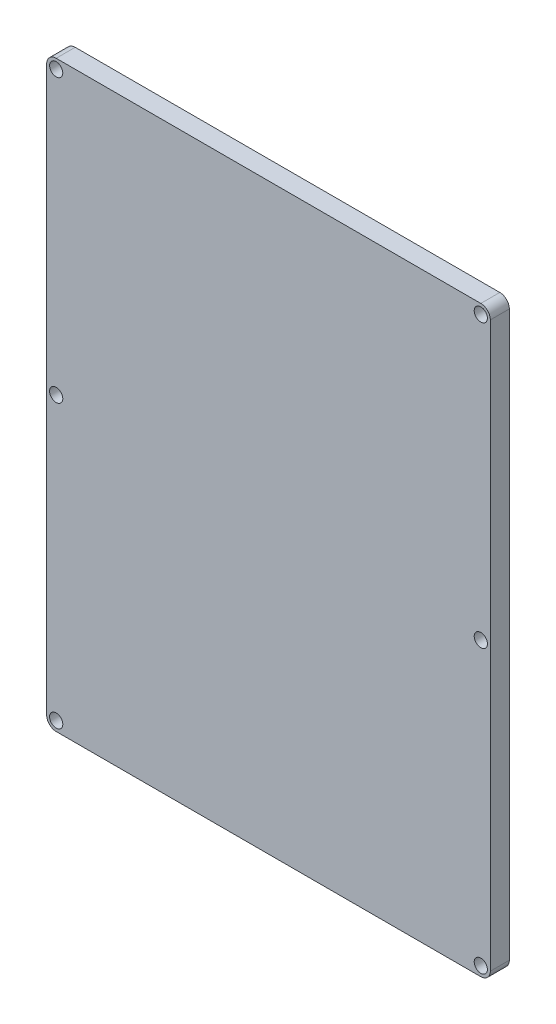
ISO-10303-21;
HEADER;
FILE_DESCRIPTION(('STEP AP214'),'2;1');
FILE_NAME('part.step','',(''),(''),'','','');
FILE_SCHEMA(('AUTOMOTIVE_DESIGN { 1 0 10303 214 1 1 1 1 }'));
ENDSEC;
DATA;
#1=APPLICATION_CONTEXT('core data for automotive mechanical design processes');
#2=APPLICATION_PROTOCOL_DEFINITION('international standard','automotive_design',2000,#1);
#3=PRODUCT_CONTEXT('',#1,'mechanical');
#4=PRODUCT('Part','Part','',(#3));
#5=PRODUCT_RELATED_PRODUCT_CATEGORY('part','',(#4));
#6=PRODUCT_DEFINITION_FORMATION('','',#4);
#7=PRODUCT_DEFINITION_CONTEXT('part definition',#1,'design');
#8=PRODUCT_DEFINITION('design','',#6,#7);
#9=PRODUCT_DEFINITION_SHAPE('','',#8);
#10=(LENGTH_UNIT() NAMED_UNIT(*) SI_UNIT(.MILLI.,.METRE.));
#11=(NAMED_UNIT(*) PLANE_ANGLE_UNIT() SI_UNIT($,.RADIAN.));
#12=(NAMED_UNIT(*) SI_UNIT($,.STERADIAN.) SOLID_ANGLE_UNIT());
#13=UNCERTAINTY_MEASURE_WITH_UNIT(LENGTH_MEASURE(1.E-05),#10,'distance_accuracy_value','');
#14=(GEOMETRIC_REPRESENTATION_CONTEXT(3) GLOBAL_UNCERTAINTY_ASSIGNED_CONTEXT((#13)) GLOBAL_UNIT_ASSIGNED_CONTEXT((#10,
#11,#12)) REPRESENTATION_CONTEXT('',''));
#15=CARTESIAN_POINT('',(0.,0.,0.));
#16=DIRECTION('',(0.,0.,1.));
#17=DIRECTION('',(1.,0.,0.));
#18=AXIS2_PLACEMENT_3D('',#15,#16,#17);
#19=CARTESIAN_POINT('',(-33.5,-46.,3.));
#20=DIRECTION('',(0.,1.,0.));
#21=DIRECTION('',(0.,0.,1.));
#22=AXIS2_PLACEMENT_3D('',#19,#20,#21);
#23=PLANE('',#22);
#24=DIRECTION('',(0.,0.,-1.));
#25=VECTOR('',#24,1.);
#26=CARTESIAN_POINT('',(-26.,-46.,0.1));
#27=LINE('',#26,#25);
#28=CARTESIAN_POINT('',(-26.,-46.,0.1));
#29=VERTEX_POINT('',#28);
#30=CARTESIAN_POINT('',(-26.,-46.,0.));
#31=VERTEX_POINT('',#30);
#32=EDGE_CURVE('E230',#29,#31,#27,.T.);
#33=ORIENTED_EDGE('',*,*,#32,.F.);
#34=DIRECTION('',(-1.,0.,0.));
#35=VECTOR('',#34,1.);
#36=CARTESIAN_POINT('',(-26.,-46.,0.1));
#37=LINE('',#36,#35);
#38=CARTESIAN_POINT('',(28.,-46.,0.1));
#39=VERTEX_POINT('',#38);
#40=EDGE_CURVE('E234',#39,#29,#37,.T.);
#41=ORIENTED_EDGE('',*,*,#40,.F.);
#42=DIRECTION('',(0.,0.,-1.));
#43=VECTOR('',#42,1.);
#44=CARTESIAN_POINT('',(28.,-46.,0.1));
#45=LINE('',#44,#43);
#46=CARTESIAN_POINT('',(28.,-46.,0.));
#47=VERTEX_POINT('',#46);
#48=EDGE_CURVE('E249',#39,#47,#45,.T.);
#49=ORIENTED_EDGE('',*,*,#48,.T.);
#50=DIRECTION('',(1.,0.,0.));
#51=VECTOR('',#50,1.);
#52=CARTESIAN_POINT('',(-33.5,-46.,0.));
#53=LINE('',#52,#51);
#54=CARTESIAN_POINT('',(33.5,-46.,0.));
#55=VERTEX_POINT('',#54);
#56=EDGE_CURVE('E130',#47,#55,#53,.T.);
#57=ORIENTED_EDGE('',*,*,#56,.T.);
#58=DIRECTION('',(0.,0.,-1.));
#59=VECTOR('',#58,1.);
#60=CARTESIAN_POINT('',(33.5,-46.,3.));
#61=LINE('',#60,#59);
#62=CARTESIAN_POINT('',(33.5,-46.,3.));
#63=VERTEX_POINT('',#62);
#64=EDGE_CURVE('E126',#63,#55,#61,.T.);
#65=ORIENTED_EDGE('',*,*,#64,.F.);
#66=DIRECTION('',(1.,0.,0.));
#67=VECTOR('',#66,1.);
#68=CARTESIAN_POINT('',(-33.5,-46.,3.));
#69=LINE('',#68,#67);
#70=CARTESIAN_POINT('',(-33.5,-46.,3.));
#71=VERTEX_POINT('',#70);
#72=EDGE_CURVE('E113',#71,#63,#69,.T.);
#73=ORIENTED_EDGE('',*,*,#72,.F.);
#74=DIRECTION('',(0.,0.,-1.));
#75=VECTOR('',#74,1.);
#76=CARTESIAN_POINT('',(-33.5,-46.,3.));
#77=LINE('',#76,#75);
#78=CARTESIAN_POINT('',(-33.5,-46.,0.));
#79=VERTEX_POINT('',#78);
#80=EDGE_CURVE('E133',#71,#79,#77,.T.);
#81=ORIENTED_EDGE('',*,*,#80,.T.);
#82=EDGE_CURVE('E154',#79,#31,#53,.T.);
#83=ORIENTED_EDGE('',*,*,#82,.T.);
#84=EDGE_LOOP('',(#33,#41,#49,#57,#65,#73,#81,#83));
#85=FACE_BOUND('',#84,.T.);
#86=ADVANCED_FACE('F32',(#85),#23,.F.);
#87=CARTESIAN_POINT('',(33.5,44.5,3.));
#88=DIRECTION('',(0.,0.,-1.));
#89=DIRECTION('',(-1.,0.,0.));
#90=AXIS2_PLACEMENT_3D('',#87,#88,#89);
#91=CYLINDRICAL_SURFACE('',#90,1.5);
#92=CARTESIAN_POINT('',(33.5,44.5,0.));
#93=DIRECTION('',(0.,0.,1.));
#94=DIRECTION('',(-1.,0.,0.));
#95=AXIS2_PLACEMENT_3D('',#92,#93,#94);
#96=CIRCLE('',#95,1.5);
#97=CARTESIAN_POINT('',(35.,44.5,0.));
#98=VERTEX_POINT('',#97);
#99=CARTESIAN_POINT('',(33.5,46.,0.));
#100=VERTEX_POINT('',#99);
#101=EDGE_CURVE('E142',#98,#100,#96,.T.);
#102=ORIENTED_EDGE('',*,*,#101,.T.);
#103=DIRECTION('',(0.,0.,-1.));
#104=VECTOR('',#103,1.);
#105=CARTESIAN_POINT('',(33.5,46.,3.));
#106=LINE('',#105,#104);
#107=CARTESIAN_POINT('',(33.5,46.,3.));
#108=VERTEX_POINT('',#107);
#109=EDGE_CURVE('E11',#108,#100,#106,.T.);
#110=ORIENTED_EDGE('',*,*,#109,.F.);
#111=CARTESIAN_POINT('',(33.5,44.5,3.));
#112=DIRECTION('',(0.,0.,1.));
#113=DIRECTION('',(-1.,0.,0.));
#114=AXIS2_PLACEMENT_3D('',#111,#112,#113);
#115=CIRCLE('',#114,1.5);
#116=CARTESIAN_POINT('',(35.,44.5,3.));
#117=VERTEX_POINT('',#116);
#118=EDGE_CURVE('E160',#117,#108,#115,.T.);
#119=ORIENTED_EDGE('',*,*,#118,.F.);
#120=DIRECTION('',(0.,0.,-1.));
#121=VECTOR('',#120,1.);
#122=CARTESIAN_POINT('',(35.,44.5,3.));
#123=LINE('',#122,#121);
#124=EDGE_CURVE('E138',#117,#98,#123,.T.);
#125=ORIENTED_EDGE('',*,*,#124,.T.);
#126=EDGE_LOOP('',(#102,#110,#119,#125));
#127=FACE_BOUND('',#126,.T.);
#128=ADVANCED_FACE('F34',(#127),#91,.T.);
#129=CARTESIAN_POINT('',(-33.5,46.,3.));
#130=DIRECTION('',(0.,-1.,0.));
#131=DIRECTION('',(0.,0.,-1.));
#132=AXIS2_PLACEMENT_3D('',#129,#130,#131);
#133=PLANE('',#132);
#134=DIRECTION('',(-1.,0.,0.));
#135=VECTOR('',#134,1.);
#136=CARTESIAN_POINT('',(-33.5,46.,0.));
#137=LINE('',#136,#135);
#138=CARTESIAN_POINT('',(-33.5,46.,0.));
#139=VERTEX_POINT('',#138);
#140=EDGE_CURVE('E145',#100,#139,#137,.T.);
#141=ORIENTED_EDGE('',*,*,#140,.T.);
#142=DIRECTION('',(0.,0.,-1.));
#143=VECTOR('',#142,1.);
#144=CARTESIAN_POINT('',(-33.5,46.,3.));
#145=LINE('',#144,#143);
#146=CARTESIAN_POINT('',(-33.5,46.,3.));
#147=VERTEX_POINT('',#146);
#148=EDGE_CURVE('E40',#147,#139,#145,.T.);
#149=ORIENTED_EDGE('',*,*,#148,.F.);
#150=DIRECTION('',(-1.,0.,0.));
#151=VECTOR('',#150,1.);
#152=CARTESIAN_POINT('',(-33.5,46.,3.));
#153=LINE('',#152,#151);
#154=EDGE_CURVE('E97',#108,#147,#153,.T.);
#155=ORIENTED_EDGE('',*,*,#154,.F.);
#156=ORIENTED_EDGE('',*,*,#109,.T.);
#157=EDGE_LOOP('',(#141,#149,#155,#156));
#158=FACE_BOUND('',#157,.T.);
#159=ADVANCED_FACE('F329',(#158),#133,.F.);
#160=CARTESIAN_POINT('',(-33.5,44.5,3.));
#161=DIRECTION('',(0.,0.,-1.));
#162=DIRECTION('',(-1.,0.,0.));
#163=AXIS2_PLACEMENT_3D('',#160,#161,#162);
#164=CYLINDRICAL_SURFACE('',#163,1.5);
#165=CARTESIAN_POINT('',(-33.5,44.5,0.));
#166=DIRECTION('',(0.,0.,1.));
#167=DIRECTION('',(-1.,0.,0.));
#168=AXIS2_PLACEMENT_3D('',#165,#166,#167);
#169=CIRCLE('',#168,1.5);
#170=CARTESIAN_POINT('',(-35.,44.5,0.));
#171=VERTEX_POINT('',#170);
#172=EDGE_CURVE('E148',#139,#171,#169,.T.);
#173=ORIENTED_EDGE('',*,*,#172,.T.);
#174=DIRECTION('',(0.,0.,-1.));
#175=VECTOR('',#174,1.);
#176=CARTESIAN_POINT('',(-35.,44.5,3.));
#177=LINE('',#176,#175);
#178=CARTESIAN_POINT('',(-35.,44.5,3.));
#179=VERTEX_POINT('',#178);
#180=EDGE_CURVE('E167',#179,#171,#177,.T.);
#181=ORIENTED_EDGE('',*,*,#180,.F.);
#182=CARTESIAN_POINT('',(-33.5,44.5,3.));
#183=DIRECTION('',(0.,0.,1.));
#184=DIRECTION('',(-1.,0.,0.));
#185=AXIS2_PLACEMENT_3D('',#182,#183,#184);
#186=CIRCLE('',#185,1.5);
#187=EDGE_CURVE('E175',#147,#179,#186,.T.);
#188=ORIENTED_EDGE('',*,*,#187,.F.);
#189=ORIENTED_EDGE('',*,*,#148,.T.);
#190=EDGE_LOOP('',(#173,#181,#188,#189));
#191=FACE_BOUND('',#190,.T.);
#192=ADVANCED_FACE('F173',(#191),#164,.T.);
#193=CARTESIAN_POINT('',(-35.,44.5,3.));
#194=DIRECTION('',(1.,0.,0.));
#195=DIRECTION('',(0.,1.,0.));
#196=AXIS2_PLACEMENT_3D('',#193,#194,#195);
#197=PLANE('',#196);
#198=DIRECTION('',(0.,-1.,0.));
#199=VECTOR('',#198,1.);
#200=CARTESIAN_POINT('',(-35.,44.5,0.));
#201=LINE('',#200,#199);
#202=CARTESIAN_POINT('',(-35.,-44.5,0.));
#203=VERTEX_POINT('',#202);
#204=EDGE_CURVE('E150',#171,#203,#201,.T.);
#205=ORIENTED_EDGE('',*,*,#204,.T.);
#206=DIRECTION('',(0.,0.,-1.));
#207=VECTOR('',#206,1.);
#208=CARTESIAN_POINT('',(-35.,-44.5,3.));
#209=LINE('',#208,#207);
#210=CARTESIAN_POINT('',(-35.,-44.5,3.));
#211=VERTEX_POINT('',#210);
#212=EDGE_CURVE('E164',#211,#203,#209,.T.);
#213=ORIENTED_EDGE('',*,*,#212,.F.);
#214=DIRECTION('',(0.,-1.,0.));
#215=VECTOR('',#214,1.);
#216=CARTESIAN_POINT('',(-35.,44.5,3.));
#217=LINE('',#216,#215);
#218=EDGE_CURVE('E189',#179,#211,#217,.T.);
#219=ORIENTED_EDGE('',*,*,#218,.F.);
#220=ORIENTED_EDGE('',*,*,#180,.T.);
#221=EDGE_LOOP('',(#205,#213,#219,#220));
#222=FACE_BOUND('',#221,.T.);
#223=ADVANCED_FACE('F185',(#222),#197,.F.);
#224=CARTESIAN_POINT('',(-33.5,-44.5,3.));
#225=DIRECTION('',(0.,0.,-1.));
#226=DIRECTION('',(-1.,0.,0.));
#227=AXIS2_PLACEMENT_3D('',#224,#225,#226);
#228=CYLINDRICAL_SURFACE('',#227,1.5);
#229=CARTESIAN_POINT('',(-33.5,-44.5,0.));
#230=DIRECTION('',(0.,0.,1.));
#231=DIRECTION('',(-1.,0.,0.));
#232=AXIS2_PLACEMENT_3D('',#229,#230,#231);
#233=CIRCLE('',#232,1.5);
#234=EDGE_CURVE('E152',#203,#79,#233,.T.);
#235=ORIENTED_EDGE('',*,*,#234,.T.);
#236=ORIENTED_EDGE('',*,*,#80,.F.);
#237=CARTESIAN_POINT('',(-33.5,-44.5,3.));
#238=DIRECTION('',(0.,0.,1.));
#239=DIRECTION('',(-1.,0.,0.));
#240=AXIS2_PLACEMENT_3D('',#237,#238,#239);
#241=CIRCLE('',#240,1.5);
#242=EDGE_CURVE('E120',#211,#71,#241,.T.);
#243=ORIENTED_EDGE('',*,*,#242,.F.);
#244=ORIENTED_EDGE('',*,*,#212,.T.);
#245=EDGE_LOOP('',(#235,#236,#243,#244));
#246=FACE_BOUND('',#245,.T.);
#247=ADVANCED_FACE('F188',(#246),#228,.T.);
#248=CARTESIAN_POINT('',(33.5,-44.5,3.));
#249=DIRECTION('',(0.,0.,-1.));
#250=DIRECTION('',(-1.,0.,0.));
#251=AXIS2_PLACEMENT_3D('',#248,#249,#250);
#252=CYLINDRICAL_SURFACE('',#251,1.5);
#253=CARTESIAN_POINT('',(33.5,-44.5,0.));
#254=DIRECTION('',(0.,0.,1.));
#255=DIRECTION('',(-1.,0.,0.));
#256=AXIS2_PLACEMENT_3D('',#253,#254,#255);
#257=CIRCLE('',#256,1.5);
#258=CARTESIAN_POINT('',(35.,-44.5,0.));
#259=VERTEX_POINT('',#258);
#260=EDGE_CURVE('E157',#55,#259,#257,.T.);
#261=ORIENTED_EDGE('',*,*,#260,.T.);
#262=DIRECTION('',(0.,0.,-1.));
#263=VECTOR('',#262,1.);
#264=CARTESIAN_POINT('',(35.,-44.5,3.));
#265=LINE('',#264,#263);
#266=CARTESIAN_POINT('',(35.,-44.5,3.));
#267=VERTEX_POINT('',#266);
#268=EDGE_CURVE('E134',#267,#259,#265,.T.);
#269=ORIENTED_EDGE('',*,*,#268,.F.);
#270=CARTESIAN_POINT('',(33.5,-44.5,3.));
#271=DIRECTION('',(0.,0.,1.));
#272=DIRECTION('',(-1.,0.,0.));
#273=AXIS2_PLACEMENT_3D('',#270,#271,#272);
#274=CIRCLE('',#273,1.5);
#275=EDGE_CURVE('E117',#63,#267,#274,.T.);
#276=ORIENTED_EDGE('',*,*,#275,.F.);
#277=ORIENTED_EDGE('',*,*,#64,.T.);
#278=EDGE_LOOP('',(#261,#269,#276,#277));
#279=FACE_BOUND('',#278,.T.);
#280=ADVANCED_FACE('F136',(#279),#252,.T.);
#281=CARTESIAN_POINT('',(35.,44.5,3.));
#282=DIRECTION('',(-1.,0.,0.));
#283=DIRECTION('',(0.,-1.,0.));
#284=AXIS2_PLACEMENT_3D('',#281,#282,#283);
#285=PLANE('',#284);
#286=DIRECTION('',(0.,1.,0.));
#287=VECTOR('',#286,1.);
#288=CARTESIAN_POINT('',(35.,44.5,0.));
#289=LINE('',#288,#287);
#290=EDGE_CURVE('E89',#259,#98,#289,.T.);
#291=ORIENTED_EDGE('',*,*,#290,.T.);
#292=ORIENTED_EDGE('',*,*,#124,.F.);
#293=DIRECTION('',(0.,1.,0.));
#294=VECTOR('',#293,1.);
#295=CARTESIAN_POINT('',(35.,44.5,3.));
#296=LINE('',#295,#294);
#297=EDGE_CURVE('E56',#267,#117,#296,.T.);
#298=ORIENTED_EDGE('',*,*,#297,.F.);
#299=ORIENTED_EDGE('',*,*,#268,.T.);
#300=EDGE_LOOP('',(#291,#292,#298,#299));
#301=FACE_BOUND('',#300,.T.);
#302=ADVANCED_FACE('F325',(#301),#285,.F.);
#303=CARTESIAN_POINT('',(33.5,44.5,3.));
#304=DIRECTION('',(0.,0.,-1.));
#305=DIRECTION('',(-1.,0.,0.));
#306=AXIS2_PLACEMENT_3D('',#303,#304,#305);
#307=PLANE('',#306);
#308=CARTESIAN_POINT('',(33.5,44.5,3.));
#309=DIRECTION('',(0.,0.,-1.));
#310=DIRECTION('',(-1.,0.,0.));
#311=AXIS2_PLACEMENT_3D('',#308,#309,#310);
#312=CIRCLE('',#311,1.0414);
#313=CARTESIAN_POINT('',(32.4586,44.5,3.));
#314=VERTEX_POINT('',#313);
#315=EDGE_CURVE('E224',#314,#314,#312,.T.);
#316=ORIENTED_EDGE('',*,*,#315,.T.);
#317=EDGE_LOOP('',(#316));
#318=FACE_BOUND('',#317,.T.);
#319=CARTESIAN_POINT('',(-33.5,-44.5,3.));
#320=DIRECTION('',(0.,0.,-1.));
#321=DIRECTION('',(-1.,0.,0.));
#322=AXIS2_PLACEMENT_3D('',#319,#320,#321);
#323=CIRCLE('',#322,1.0414);
#324=CARTESIAN_POINT('',(-34.5414,-44.5,3.));
#325=VERTEX_POINT('',#324);
#326=EDGE_CURVE('E218',#325,#325,#323,.T.);
#327=ORIENTED_EDGE('',*,*,#326,.T.);
#328=EDGE_LOOP('',(#327));
#329=FACE_BOUND('',#328,.T.);
#330=CARTESIAN_POINT('',(-33.5,0.,3.));
#331=DIRECTION('',(0.,0.,-1.));
#332=DIRECTION('',(-1.,0.,0.));
#333=AXIS2_PLACEMENT_3D('',#330,#331,#332);
#334=CIRCLE('',#333,1.0414);
#335=CARTESIAN_POINT('',(-34.5414,0.,3.));
#336=VERTEX_POINT('',#335);
#337=EDGE_CURVE('E212',#336,#336,#334,.T.);
#338=ORIENTED_EDGE('',*,*,#337,.T.);
#339=EDGE_LOOP('',(#338));
#340=FACE_BOUND('',#339,.T.);
#341=CARTESIAN_POINT('',(33.5,0.,3.));
#342=DIRECTION('',(0.,0.,-1.));
#343=DIRECTION('',(-1.,0.,0.));
#344=AXIS2_PLACEMENT_3D('',#341,#342,#343);
#345=CIRCLE('',#344,1.0414);
#346=CARTESIAN_POINT('',(32.4586,0.,3.));
#347=VERTEX_POINT('',#346);
#348=EDGE_CURVE('E206',#347,#347,#345,.T.);
#349=ORIENTED_EDGE('',*,*,#348,.T.);
#350=EDGE_LOOP('',(#349));
#351=FACE_BOUND('',#350,.T.);
#352=CARTESIAN_POINT('',(33.5,-44.5,3.));
#353=DIRECTION('',(0.,0.,-1.));
#354=DIRECTION('',(-1.,0.,0.));
#355=AXIS2_PLACEMENT_3D('',#352,#353,#354);
#356=CIRCLE('',#355,1.0414);
#357=CARTESIAN_POINT('',(32.4586,-44.5,3.));
#358=VERTEX_POINT('',#357);
#359=EDGE_CURVE('E200',#358,#358,#356,.T.);
#360=ORIENTED_EDGE('',*,*,#359,.T.);
#361=EDGE_LOOP('',(#360));
#362=FACE_BOUND('',#361,.T.);
#363=CARTESIAN_POINT('',(-33.5,44.5,3.));
#364=DIRECTION('',(0.,0.,-1.));
#365=DIRECTION('',(-1.,0.,0.));
#366=AXIS2_PLACEMENT_3D('',#363,#364,#365);
#367=CIRCLE('',#366,1.0414);
#368=CARTESIAN_POINT('',(-34.5414,44.5,3.));
#369=VERTEX_POINT('',#368);
#370=EDGE_CURVE('E146',#369,#369,#367,.T.);
#371=ORIENTED_EDGE('',*,*,#370,.T.);
#372=EDGE_LOOP('',(#371));
#373=FACE_BOUND('',#372,.T.);
#374=ORIENTED_EDGE('',*,*,#118,.T.);
#375=ORIENTED_EDGE('',*,*,#154,.T.);
#376=ORIENTED_EDGE('',*,*,#187,.T.);
#377=ORIENTED_EDGE('',*,*,#218,.T.);
#378=ORIENTED_EDGE('',*,*,#242,.T.);
#379=ORIENTED_EDGE('',*,*,#72,.T.);
#380=ORIENTED_EDGE('',*,*,#275,.T.);
#381=ORIENTED_EDGE('',*,*,#297,.T.);
#382=EDGE_LOOP('',(#374,#375,#376,#377,#378,#379,#380,#381));
#383=FACE_BOUND('',#382,.T.);
#384=ADVANCED_FACE('F115',(#318,#329,#340,#351,#362,#373,#383),#307,.F.);
#385=CARTESIAN_POINT('',(33.5,44.5,0.));
#386=DIRECTION('',(0.,0.,-1.));
#387=DIRECTION('',(-1.,0.,0.));
#388=AXIS2_PLACEMENT_3D('',#385,#386,#387);
#389=PLANE('',#388);
#390=CARTESIAN_POINT('',(-26.,-45.,0.));
#391=DIRECTION('',(0.,0.,-1.));
#392=DIRECTION('',(1.,0.,0.));
#393=AXIS2_PLACEMENT_3D('',#390,#391,#392);
#394=CIRCLE('',#393,1.);
#395=CARTESIAN_POINT('',(-27.,-45.,0.));
#396=VERTEX_POINT('',#395);
#397=EDGE_CURVE('E47',#31,#396,#394,.T.);
#398=ORIENTED_EDGE('',*,*,#397,.F.);
#399=ORIENTED_EDGE('',*,*,#82,.F.);
#400=ORIENTED_EDGE('',*,*,#234,.F.);
#401=ORIENTED_EDGE('',*,*,#204,.F.);
#402=ORIENTED_EDGE('',*,*,#172,.F.);
#403=ORIENTED_EDGE('',*,*,#140,.F.);
#404=ORIENTED_EDGE('',*,*,#101,.F.);
#405=ORIENTED_EDGE('',*,*,#290,.F.);
#406=ORIENTED_EDGE('',*,*,#260,.F.);
#407=ORIENTED_EDGE('',*,*,#56,.F.);
#408=CARTESIAN_POINT('',(28.,-45.,0.));
#409=DIRECTION('',(0.,0.,-1.));
#410=DIRECTION('',(1.,0.,0.));
#411=AXIS2_PLACEMENT_3D('',#408,#409,#410);
#412=CIRCLE('',#411,1.);
#413=CARTESIAN_POINT('',(29.,-45.,0.));
#414=VERTEX_POINT('',#413);
#415=EDGE_CURVE('E252',#414,#47,#412,.T.);
#416=ORIENTED_EDGE('',*,*,#415,.F.);
#417=DIRECTION('',(0.,-1.,0.));
#418=VECTOR('',#417,1.);
#419=CARTESIAN_POINT('',(29.,43.,0.));
#420=LINE('',#419,#418);
#421=CARTESIAN_POINT('',(29.,43.,0.));
#422=VERTEX_POINT('',#421);
#423=EDGE_CURVE('E256',#422,#414,#420,.T.);
#424=ORIENTED_EDGE('',*,*,#423,.F.);
#425=CARTESIAN_POINT('',(28.,43.,0.));
#426=DIRECTION('',(0.,0.,-1.));
#427=DIRECTION('',(1.,0.,0.));
#428=AXIS2_PLACEMENT_3D('',#425,#426,#427);
#429=CIRCLE('',#428,1.);
#430=CARTESIAN_POINT('',(28.,44.,0.));
#431=VERTEX_POINT('',#430);
#432=EDGE_CURVE('E259',#431,#422,#429,.T.);
#433=ORIENTED_EDGE('',*,*,#432,.F.);
#434=DIRECTION('',(1.,0.,0.));
#435=VECTOR('',#434,1.);
#436=CARTESIAN_POINT('',(-26.,44.,0.));
#437=LINE('',#436,#435);
#438=CARTESIAN_POINT('',(-26.,44.,0.));
#439=VERTEX_POINT('',#438);
#440=EDGE_CURVE('E262',#439,#431,#437,.T.);
#441=ORIENTED_EDGE('',*,*,#440,.F.);
#442=CARTESIAN_POINT('',(-26.,43.,0.));
#443=DIRECTION('',(0.,0.,-1.));
#444=DIRECTION('',(1.,0.,0.));
#445=AXIS2_PLACEMENT_3D('',#442,#443,#444);
#446=CIRCLE('',#445,1.);
#447=CARTESIAN_POINT('',(-27.,43.,0.));
#448=VERTEX_POINT('',#447);
#449=EDGE_CURVE('E265',#448,#439,#446,.T.);
#450=ORIENTED_EDGE('',*,*,#449,.F.);
#451=DIRECTION('',(0.,1.,0.));
#452=VECTOR('',#451,1.);
#453=CARTESIAN_POINT('',(-27.,43.,0.));
#454=LINE('',#453,#452);
#455=EDGE_CURVE('E268',#396,#448,#454,.T.);
#456=ORIENTED_EDGE('',*,*,#455,.F.);
#457=EDGE_LOOP('',(#398,#399,#400,#401,#402,#403,#404,#405,#406,#407,#416,#424,#433,#441,#450,#456));
#458=FACE_BOUND('',#457,.T.);
#459=CARTESIAN_POINT('',(33.5,44.5,0.));
#460=DIRECTION('',(0.,0.,-1.));
#461=DIRECTION('',(-1.,0.,0.));
#462=AXIS2_PLACEMENT_3D('',#459,#460,#461);
#463=CIRCLE('',#462,1.0414);
#464=CARTESIAN_POINT('',(32.4586,44.5,0.));
#465=VERTEX_POINT('',#464);
#466=EDGE_CURVE('E227',#465,#465,#463,.T.);
#467=ORIENTED_EDGE('',*,*,#466,.F.);
#468=EDGE_LOOP('',(#467));
#469=FACE_BOUND('',#468,.T.);
#470=CARTESIAN_POINT('',(-33.5,-44.5,0.));
#471=DIRECTION('',(0.,0.,-1.));
#472=DIRECTION('',(-1.,0.,0.));
#473=AXIS2_PLACEMENT_3D('',#470,#471,#472);
#474=CIRCLE('',#473,1.0414);
#475=CARTESIAN_POINT('',(-34.5414,-44.5,0.));
#476=VERTEX_POINT('',#475);
#477=EDGE_CURVE('E221',#476,#476,#474,.T.);
#478=ORIENTED_EDGE('',*,*,#477,.F.);
#479=EDGE_LOOP('',(#478));
#480=FACE_BOUND('',#479,.T.);
#481=CARTESIAN_POINT('',(-33.5,0.,0.));
#482=DIRECTION('',(0.,0.,-1.));
#483=DIRECTION('',(-1.,0.,0.));
#484=AXIS2_PLACEMENT_3D('',#481,#482,#483);
#485=CIRCLE('',#484,1.0414);
#486=CARTESIAN_POINT('',(-34.5414,0.,0.));
#487=VERTEX_POINT('',#486);
#488=EDGE_CURVE('E215',#487,#487,#485,.T.);
#489=ORIENTED_EDGE('',*,*,#488,.F.);
#490=EDGE_LOOP('',(#489));
#491=FACE_BOUND('',#490,.T.);
#492=CARTESIAN_POINT('',(33.5,0.,0.));
#493=DIRECTION('',(0.,0.,-1.));
#494=DIRECTION('',(-1.,0.,0.));
#495=AXIS2_PLACEMENT_3D('',#492,#493,#494);
#496=CIRCLE('',#495,1.0414);
#497=CARTESIAN_POINT('',(32.4586,0.,0.));
#498=VERTEX_POINT('',#497);
#499=EDGE_CURVE('E209',#498,#498,#496,.T.);
#500=ORIENTED_EDGE('',*,*,#499,.F.);
#501=EDGE_LOOP('',(#500));
#502=FACE_BOUND('',#501,.T.);
#503=CARTESIAN_POINT('',(33.5,-44.5,0.));
#504=DIRECTION('',(0.,0.,-1.));
#505=DIRECTION('',(-1.,0.,0.));
#506=AXIS2_PLACEMENT_3D('',#503,#504,#505);
#507=CIRCLE('',#506,1.0414);
#508=CARTESIAN_POINT('',(32.4586,-44.5,0.));
#509=VERTEX_POINT('',#508);
#510=EDGE_CURVE('E203',#509,#509,#507,.T.);
#511=ORIENTED_EDGE('',*,*,#510,.F.);
#512=EDGE_LOOP('',(#511));
#513=FACE_BOUND('',#512,.T.);
#514=CARTESIAN_POINT('',(-33.5,44.5,0.));
#515=DIRECTION('',(0.,0.,-1.));
#516=DIRECTION('',(-1.,0.,0.));
#517=AXIS2_PLACEMENT_3D('',#514,#515,#516);
#518=CIRCLE('',#517,1.0414);
#519=CARTESIAN_POINT('',(-34.5414,44.5,0.));
#520=VERTEX_POINT('',#519);
#521=EDGE_CURVE('E197',#520,#520,#518,.T.);
#522=ORIENTED_EDGE('',*,*,#521,.F.);
#523=EDGE_LOOP('',(#522));
#524=FACE_BOUND('',#523,.T.);
#525=ADVANCED_FACE('F178',(#458,#469,#480,#491,#502,#513,#524),#389,.T.);
#526=CARTESIAN_POINT('',(-33.5,44.5,0.));
#527=DIRECTION('',(0.,0.,-1.));
#528=DIRECTION('',(-1.,0.,0.));
#529=AXIS2_PLACEMENT_3D('',#526,#527,#528);
#530=CYLINDRICAL_SURFACE('',#529,1.0414);
#531=ORIENTED_EDGE('',*,*,#370,.F.);
#532=EDGE_LOOP('',(#531));
#533=FACE_BOUND('',#532,.T.);
#534=ORIENTED_EDGE('',*,*,#521,.T.);
#535=EDGE_LOOP('',(#534));
#536=FACE_BOUND('',#535,.T.);
#537=ADVANCED_FACE('F378',(#533,#536),#530,.F.);
#538=CARTESIAN_POINT('',(33.5,-44.5,0.));
#539=DIRECTION('',(0.,0.,-1.));
#540=DIRECTION('',(-1.,0.,0.));
#541=AXIS2_PLACEMENT_3D('',#538,#539,#540);
#542=CYLINDRICAL_SURFACE('',#541,1.0414);
#543=ORIENTED_EDGE('',*,*,#359,.F.);
#544=EDGE_LOOP('',(#543));
#545=FACE_BOUND('',#544,.T.);
#546=ORIENTED_EDGE('',*,*,#510,.T.);
#547=EDGE_LOOP('',(#546));
#548=FACE_BOUND('',#547,.T.);
#549=ADVANCED_FACE('F385',(#545,#548),#542,.F.);
#550=CARTESIAN_POINT('',(33.5,0.,0.));
#551=DIRECTION('',(0.,0.,-1.));
#552=DIRECTION('',(-1.,0.,0.));
#553=AXIS2_PLACEMENT_3D('',#550,#551,#552);
#554=CYLINDRICAL_SURFACE('',#553,1.0414);
#555=ORIENTED_EDGE('',*,*,#348,.F.);
#556=EDGE_LOOP('',(#555));
#557=FACE_BOUND('',#556,.T.);
#558=ORIENTED_EDGE('',*,*,#499,.T.);
#559=EDGE_LOOP('',(#558));
#560=FACE_BOUND('',#559,.T.);
#561=ADVANCED_FACE('F393',(#557,#560),#554,.F.);
#562=CARTESIAN_POINT('',(-33.5,0.,0.));
#563=DIRECTION('',(0.,0.,-1.));
#564=DIRECTION('',(-1.,0.,0.));
#565=AXIS2_PLACEMENT_3D('',#562,#563,#564);
#566=CYLINDRICAL_SURFACE('',#565,1.0414);
#567=ORIENTED_EDGE('',*,*,#337,.F.);
#568=EDGE_LOOP('',(#567));
#569=FACE_BOUND('',#568,.T.);
#570=ORIENTED_EDGE('',*,*,#488,.T.);
#571=EDGE_LOOP('',(#570));
#572=FACE_BOUND('',#571,.T.);
#573=ADVANCED_FACE('F401',(#569,#572),#566,.F.);
#574=CARTESIAN_POINT('',(-33.5,-44.5,0.));
#575=DIRECTION('',(0.,0.,-1.));
#576=DIRECTION('',(-1.,0.,0.));
#577=AXIS2_PLACEMENT_3D('',#574,#575,#576);
#578=CYLINDRICAL_SURFACE('',#577,1.0414);
#579=ORIENTED_EDGE('',*,*,#326,.F.);
#580=EDGE_LOOP('',(#579));
#581=FACE_BOUND('',#580,.T.);
#582=ORIENTED_EDGE('',*,*,#477,.T.);
#583=EDGE_LOOP('',(#582));
#584=FACE_BOUND('',#583,.T.);
#585=ADVANCED_FACE('F409',(#581,#584),#578,.F.);
#586=CARTESIAN_POINT('',(33.5,44.5,0.));
#587=DIRECTION('',(0.,0.,-1.));
#588=DIRECTION('',(-1.,0.,0.));
#589=AXIS2_PLACEMENT_3D('',#586,#587,#588);
#590=CYLINDRICAL_SURFACE('',#589,1.0414);
#591=ORIENTED_EDGE('',*,*,#315,.F.);
#592=EDGE_LOOP('',(#591));
#593=FACE_BOUND('',#592,.T.);
#594=ORIENTED_EDGE('',*,*,#466,.T.);
#595=EDGE_LOOP('',(#594));
#596=FACE_BOUND('',#595,.T.);
#597=ADVANCED_FACE('F417',(#593,#596),#590,.F.);
#598=CARTESIAN_POINT('',(-26.,-45.,0.1));
#599=DIRECTION('',(0.,0.,-1.));
#600=DIRECTION('',(-1.,0.,0.));
#601=AXIS2_PLACEMENT_3D('',#598,#599,#600);
#602=CYLINDRICAL_SURFACE('',#601,1.);
#603=ORIENTED_EDGE('',*,*,#397,.T.);
#604=DIRECTION('',(0.,0.,-1.));
#605=VECTOR('',#604,1.);
#606=CARTESIAN_POINT('',(-27.,-45.,0.1));
#607=LINE('',#606,#605);
#608=CARTESIAN_POINT('',(-27.,-45.,0.1));
#609=VERTEX_POINT('',#608);
#610=EDGE_CURVE('E231',#609,#396,#607,.T.);
#611=ORIENTED_EDGE('',*,*,#610,.F.);
#612=CARTESIAN_POINT('',(-26.,-45.,0.1));
#613=DIRECTION('',(0.,0.,-1.));
#614=DIRECTION('',(1.,0.,0.));
#615=AXIS2_PLACEMENT_3D('',#612,#613,#614);
#616=CIRCLE('',#615,1.);
#617=EDGE_CURVE('E255',#29,#609,#616,.T.);
#618=ORIENTED_EDGE('',*,*,#617,.F.);
#619=ORIENTED_EDGE('',*,*,#32,.T.);
#620=EDGE_LOOP('',(#603,#611,#618,#619));
#621=FACE_BOUND('',#620,.T.);
#622=ADVANCED_FACE('F301',(#621),#602,.F.);
#623=CARTESIAN_POINT('',(28.,-45.,0.1));
#624=DIRECTION('',(0.,0.,-1.));
#625=DIRECTION('',(-1.,0.,0.));
#626=AXIS2_PLACEMENT_3D('',#623,#624,#625);
#627=CYLINDRICAL_SURFACE('',#626,1.);
#628=ORIENTED_EDGE('',*,*,#415,.T.);
#629=ORIENTED_EDGE('',*,*,#48,.F.);
#630=CARTESIAN_POINT('',(28.,-45.,0.1));
#631=DIRECTION('',(0.,0.,-1.));
#632=DIRECTION('',(1.,0.,0.));
#633=AXIS2_PLACEMENT_3D('',#630,#631,#632);
#634=CIRCLE('',#633,1.);
#635=CARTESIAN_POINT('',(29.,-45.,0.1));
#636=VERTEX_POINT('',#635);
#637=EDGE_CURVE('E274',#636,#39,#634,.T.);
#638=ORIENTED_EDGE('',*,*,#637,.F.);
#639=DIRECTION('',(0.,0.,-1.));
#640=VECTOR('',#639,1.);
#641=CARTESIAN_POINT('',(29.,-45.,0.1));
#642=LINE('',#641,#640);
#643=EDGE_CURVE('E246',#636,#414,#642,.T.);
#644=ORIENTED_EDGE('',*,*,#643,.T.);
#645=EDGE_LOOP('',(#628,#629,#638,#644));
#646=FACE_BOUND('',#645,.T.);
#647=ADVANCED_FACE('F321',(#646),#627,.F.);
#648=CARTESIAN_POINT('',(29.,43.,0.1));
#649=DIRECTION('',(1.,0.,0.));
#650=DIRECTION('',(0.,1.,0.));
#651=AXIS2_PLACEMENT_3D('',#648,#649,#650);
#652=PLANE('',#651);
#653=ORIENTED_EDGE('',*,*,#423,.T.);
#654=ORIENTED_EDGE('',*,*,#643,.F.);
#655=DIRECTION('',(0.,-1.,0.));
#656=VECTOR('',#655,1.);
#657=CARTESIAN_POINT('',(29.,43.,0.1));
#658=LINE('',#657,#656);
#659=CARTESIAN_POINT('',(29.,43.,0.1));
#660=VERTEX_POINT('',#659);
#661=EDGE_CURVE('E277',#660,#636,#658,.T.);
#662=ORIENTED_EDGE('',*,*,#661,.F.);
#663=DIRECTION('',(0.,0.,-1.));
#664=VECTOR('',#663,1.);
#665=CARTESIAN_POINT('',(29.,43.,0.1));
#666=LINE('',#665,#664);
#667=EDGE_CURVE('E243',#660,#422,#666,.T.);
#668=ORIENTED_EDGE('',*,*,#667,.T.);
#669=EDGE_LOOP('',(#653,#654,#662,#668));
#670=FACE_BOUND('',#669,.T.);
#671=ADVANCED_FACE('F437',(#670),#652,.F.);
#672=CARTESIAN_POINT('',(28.,43.,0.1));
#673=DIRECTION('',(0.,0.,-1.));
#674=DIRECTION('',(-1.,0.,0.));
#675=AXIS2_PLACEMENT_3D('',#672,#673,#674);
#676=CYLINDRICAL_SURFACE('',#675,1.);
#677=ORIENTED_EDGE('',*,*,#432,.T.);
#678=ORIENTED_EDGE('',*,*,#667,.F.);
#679=CARTESIAN_POINT('',(28.,43.,0.1));
#680=DIRECTION('',(0.,0.,-1.));
#681=DIRECTION('',(1.,0.,0.));
#682=AXIS2_PLACEMENT_3D('',#679,#680,#681);
#683=CIRCLE('',#682,1.);
#684=CARTESIAN_POINT('',(28.,44.,0.1));
#685=VERTEX_POINT('',#684);
#686=EDGE_CURVE('E280',#685,#660,#683,.T.);
#687=ORIENTED_EDGE('',*,*,#686,.F.);
#688=DIRECTION('',(0.,0.,-1.));
#689=VECTOR('',#688,1.);
#690=CARTESIAN_POINT('',(28.,44.,0.1));
#691=LINE('',#690,#689);
#692=EDGE_CURVE('E240',#685,#431,#691,.T.);
#693=ORIENTED_EDGE('',*,*,#692,.T.);
#694=EDGE_LOOP('',(#677,#678,#687,#693));
#695=FACE_BOUND('',#694,.T.);
#696=ADVANCED_FACE('F444',(#695),#676,.F.);
#697=CARTESIAN_POINT('',(-26.,44.,0.1));
#698=DIRECTION('',(0.,1.,0.));
#699=DIRECTION('',(0.,0.,1.));
#700=AXIS2_PLACEMENT_3D('',#697,#698,#699);
#701=PLANE('',#700);
#702=ORIENTED_EDGE('',*,*,#440,.T.);
#703=ORIENTED_EDGE('',*,*,#692,.F.);
#704=DIRECTION('',(1.,0.,0.));
#705=VECTOR('',#704,1.);
#706=CARTESIAN_POINT('',(-26.,44.,0.1));
#707=LINE('',#706,#705);
#708=CARTESIAN_POINT('',(-26.,44.,0.1));
#709=VERTEX_POINT('',#708);
#710=EDGE_CURVE('E283',#709,#685,#707,.T.);
#711=ORIENTED_EDGE('',*,*,#710,.F.);
#712=DIRECTION('',(0.,0.,-1.));
#713=VECTOR('',#712,1.);
#714=CARTESIAN_POINT('',(-26.,44.,0.1));
#715=LINE('',#714,#713);
#716=EDGE_CURVE('E237',#709,#439,#715,.T.);
#717=ORIENTED_EDGE('',*,*,#716,.T.);
#718=EDGE_LOOP('',(#702,#703,#711,#717));
#719=FACE_BOUND('',#718,.T.);
#720=ADVANCED_FACE('F452',(#719),#701,.F.);
#721=CARTESIAN_POINT('',(-26.,43.,0.1));
#722=DIRECTION('',(0.,0.,-1.));
#723=DIRECTION('',(-1.,0.,0.));
#724=AXIS2_PLACEMENT_3D('',#721,#722,#723);
#725=CYLINDRICAL_SURFACE('',#724,1.);
#726=ORIENTED_EDGE('',*,*,#449,.T.);
#727=ORIENTED_EDGE('',*,*,#716,.F.);
#728=CARTESIAN_POINT('',(-26.,43.,0.1));
#729=DIRECTION('',(0.,0.,-1.));
#730=DIRECTION('',(1.,0.,0.));
#731=AXIS2_PLACEMENT_3D('',#728,#729,#730);
#732=CIRCLE('',#731,1.);
#733=CARTESIAN_POINT('',(-27.,43.,0.1));
#734=VERTEX_POINT('',#733);
#735=EDGE_CURVE('E286',#734,#709,#732,.T.);
#736=ORIENTED_EDGE('',*,*,#735,.F.);
#737=DIRECTION('',(0.,0.,-1.));
#738=VECTOR('',#737,1.);
#739=CARTESIAN_POINT('',(-27.,43.,0.1));
#740=LINE('',#739,#738);
#741=EDGE_CURVE('E233',#734,#448,#740,.T.);
#742=ORIENTED_EDGE('',*,*,#741,.T.);
#743=EDGE_LOOP('',(#726,#727,#736,#742));
#744=FACE_BOUND('',#743,.T.);
#745=ADVANCED_FACE('F460',(#744),#725,.F.);
#746=CARTESIAN_POINT('',(-27.,43.,0.1));
#747=DIRECTION('',(-1.,0.,0.));
#748=DIRECTION('',(0.,-1.,0.));
#749=AXIS2_PLACEMENT_3D('',#746,#747,#748);
#750=PLANE('',#749);
#751=ORIENTED_EDGE('',*,*,#455,.T.);
#752=ORIENTED_EDGE('',*,*,#741,.F.);
#753=DIRECTION('',(0.,1.,0.));
#754=VECTOR('',#753,1.);
#755=CARTESIAN_POINT('',(-27.,43.,0.1));
#756=LINE('',#755,#754);
#757=EDGE_CURVE('E289',#609,#734,#756,.T.);
#758=ORIENTED_EDGE('',*,*,#757,.F.);
#759=ORIENTED_EDGE('',*,*,#610,.T.);
#760=EDGE_LOOP('',(#751,#752,#758,#759));
#761=FACE_BOUND('',#760,.T.);
#762=ADVANCED_FACE('F468',(#761),#750,.F.);
#763=CARTESIAN_POINT('',(-26.,-45.,0.1));
#764=DIRECTION('',(0.,0.,1.));
#765=DIRECTION('',(1.,0.,0.));
#766=AXIS2_PLACEMENT_3D('',#763,#764,#765);
#767=PLANE('',#766);
#768=ORIENTED_EDGE('',*,*,#617,.T.);
#769=ORIENTED_EDGE('',*,*,#757,.T.);
#770=ORIENTED_EDGE('',*,*,#735,.T.);
#771=ORIENTED_EDGE('',*,*,#710,.T.);
#772=ORIENTED_EDGE('',*,*,#686,.T.);
#773=ORIENTED_EDGE('',*,*,#661,.T.);
#774=ORIENTED_EDGE('',*,*,#637,.T.);
#775=ORIENTED_EDGE('',*,*,#40,.T.);
#776=EDGE_LOOP('',(#768,#769,#770,#771,#772,#773,#774,#775));
#777=FACE_BOUND('',#776,.T.);
#778=ADVANCED_FACE('F296',(#777),#767,.F.);
#779=CLOSED_SHELL('',(#86,#128,#159,#192,#223,#247,#280,#302,#384,#525,#537,#549,#561,#573,#585,
#597,#622,#647,#671,#696,#720,#745,#762,#778));
#780=MANIFOLD_SOLID_BREP('B2',#779);
#781=ADVANCED_BREP_SHAPE_REPRESENTATION('',(#18,#780),#14);
#782=SHAPE_DEFINITION_REPRESENTATION(#9,#781);
ENDSEC;
END-ISO-10303-21;
